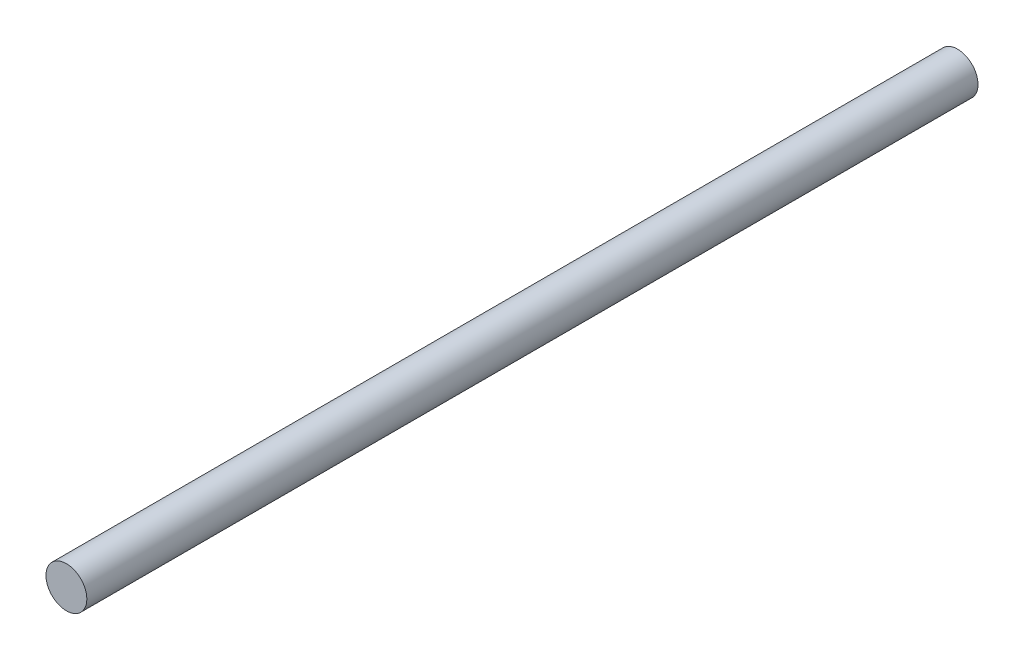
ISO-10303-21;
HEADER;
FILE_DESCRIPTION(('STEP AP214'),'2;1');
FILE_NAME('part.step','',(''),(''),'','','');
FILE_SCHEMA(('AUTOMOTIVE_DESIGN { 1 0 10303 214 1 1 1 1 }'));
ENDSEC;
DATA;
#1=APPLICATION_CONTEXT('core data for automotive mechanical design processes');
#2=APPLICATION_PROTOCOL_DEFINITION('international standard','automotive_design',2000,#1);
#3=PRODUCT_CONTEXT('',#1,'mechanical');
#4=PRODUCT('Part','Part','',(#3));
#5=PRODUCT_RELATED_PRODUCT_CATEGORY('part','',(#4));
#6=PRODUCT_DEFINITION_FORMATION('','',#4);
#7=PRODUCT_DEFINITION_CONTEXT('part definition',#1,'design');
#8=PRODUCT_DEFINITION('design','',#6,#7);
#9=PRODUCT_DEFINITION_SHAPE('','',#8);
#10=(LENGTH_UNIT() NAMED_UNIT(*) SI_UNIT(.MILLI.,.METRE.));
#11=(NAMED_UNIT(*) PLANE_ANGLE_UNIT() SI_UNIT($,.RADIAN.));
#12=(NAMED_UNIT(*) SI_UNIT($,.STERADIAN.) SOLID_ANGLE_UNIT());
#13=UNCERTAINTY_MEASURE_WITH_UNIT(LENGTH_MEASURE(1.E-05),#10,'distance_accuracy_value','');
#14=(GEOMETRIC_REPRESENTATION_CONTEXT(3) GLOBAL_UNCERTAINTY_ASSIGNED_CONTEXT((#13)) GLOBAL_UNIT_ASSIGNED_CONTEXT((#10,
#11,#12)) REPRESENTATION_CONTEXT('',''));
#15=CARTESIAN_POINT('',(0.,0.,0.));
#16=DIRECTION('',(0.,0.,1.));
#17=DIRECTION('',(1.,0.,0.));
#18=AXIS2_PLACEMENT_3D('',#15,#16,#17);
#19=CARTESIAN_POINT('',(0.,0.,218.));
#20=DIRECTION('',(0.,0.,-1.));
#21=DIRECTION('',(-1.,0.,0.));
#22=AXIS2_PLACEMENT_3D('',#19,#20,#21);
#23=CYLINDRICAL_SURFACE('',#22,5.);
#24=CARTESIAN_POINT('',(0.,0.,218.));
#25=DIRECTION('',(0.,0.,1.));
#26=DIRECTION('',(1.,0.,0.));
#27=AXIS2_PLACEMENT_3D('',#24,#25,#26);
#28=CIRCLE('',#27,5.);
#29=CARTESIAN_POINT('',(5.,0.,218.));
#30=VERTEX_POINT('',#29);
#31=EDGE_CURVE('E10',#30,#30,#28,.T.);
#32=ORIENTED_EDGE('',*,*,#31,.F.);
#33=EDGE_LOOP('',(#32));
#34=FACE_BOUND('',#33,.T.);
#35=CARTESIAN_POINT('',(0.,0.,0.));
#36=DIRECTION('',(0.,0.,1.));
#37=DIRECTION('',(1.,0.,0.));
#38=AXIS2_PLACEMENT_3D('',#35,#36,#37);
#39=CIRCLE('',#38,5.);
#40=CARTESIAN_POINT('',(5.,0.,0.));
#41=VERTEX_POINT('',#40);
#42=EDGE_CURVE('E42',#41,#41,#39,.T.);
#43=ORIENTED_EDGE('',*,*,#42,.T.);
#44=EDGE_LOOP('',(#43));
#45=FACE_BOUND('',#44,.T.);
#46=ADVANCED_FACE('F39',(#34,#45),#23,.T.);
#47=CARTESIAN_POINT('',(0.,0.,218.));
#48=DIRECTION('',(0.,0.,1.));
#49=DIRECTION('',(1.,0.,0.));
#50=AXIS2_PLACEMENT_3D('',#47,#48,#49);
#51=PLANE('',#50);
#52=ORIENTED_EDGE('',*,*,#31,.T.);
#53=EDGE_LOOP('',(#52));
#54=FACE_BOUND('',#53,.T.);
#55=ADVANCED_FACE('F54',(#54),#51,.T.);
#56=CARTESIAN_POINT('',(0.,0.,0.));
#57=DIRECTION('',(0.,0.,1.));
#58=DIRECTION('',(1.,0.,0.));
#59=AXIS2_PLACEMENT_3D('',#56,#57,#58);
#60=PLANE('',#59);
#61=ORIENTED_EDGE('',*,*,#42,.F.);
#62=EDGE_LOOP('',(#61));
#63=FACE_BOUND('',#62,.T.);
#64=ADVANCED_FACE('F52',(#63),#60,.F.);
#65=CLOSED_SHELL('',(#46,#55,#64));
#66=MANIFOLD_SOLID_BREP('B2',#65);
#67=ADVANCED_BREP_SHAPE_REPRESENTATION('',(#18,#66),#14);
#68=SHAPE_DEFINITION_REPRESENTATION(#9,#67);
ENDSEC;
END-ISO-10303-21;
